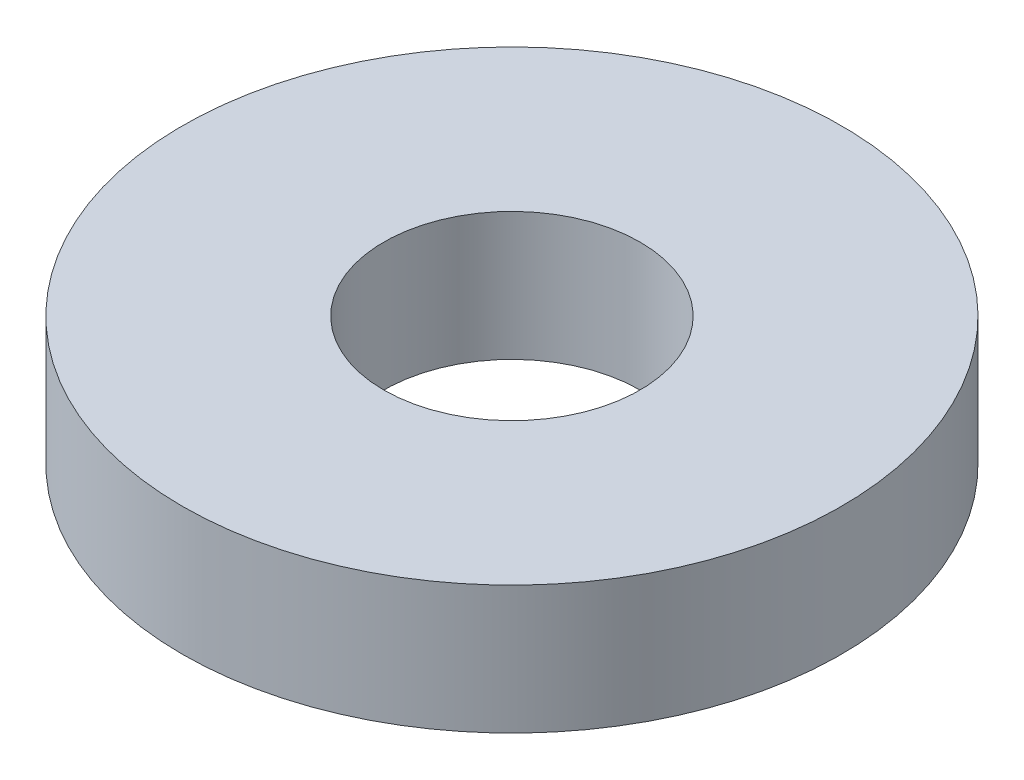
ISO-10303-21;
HEADER;
FILE_DESCRIPTION(('STEP AP214'),'2;1');
FILE_NAME('part.step','',(''),(''),'','','');
FILE_SCHEMA(('AUTOMOTIVE_DESIGN { 1 0 10303 214 1 1 1 1 }'));
ENDSEC;
DATA;
#1=APPLICATION_CONTEXT('core data for automotive mechanical design processes');
#2=APPLICATION_PROTOCOL_DEFINITION('international standard','automotive_design',2000,#1);
#3=PRODUCT_CONTEXT('',#1,'mechanical');
#4=PRODUCT('Part','Part','',(#3));
#5=PRODUCT_RELATED_PRODUCT_CATEGORY('part','',(#4));
#6=PRODUCT_DEFINITION_FORMATION('','',#4);
#7=PRODUCT_DEFINITION_CONTEXT('part definition',#1,'design');
#8=PRODUCT_DEFINITION('design','',#6,#7);
#9=PRODUCT_DEFINITION_SHAPE('','',#8);
#10=(LENGTH_UNIT() NAMED_UNIT(*) SI_UNIT(.MILLI.,.METRE.));
#11=(NAMED_UNIT(*) PLANE_ANGLE_UNIT() SI_UNIT($,.RADIAN.));
#12=(NAMED_UNIT(*) SI_UNIT($,.STERADIAN.) SOLID_ANGLE_UNIT());
#13=UNCERTAINTY_MEASURE_WITH_UNIT(LENGTH_MEASURE(1.E-05),#10,'distance_accuracy_value','');
#14=(GEOMETRIC_REPRESENTATION_CONTEXT(3) GLOBAL_UNCERTAINTY_ASSIGNED_CONTEXT((#13)) GLOBAL_UNIT_ASSIGNED_CONTEXT((#10,
#11,#12)) REPRESENTATION_CONTEXT('',''));
#15=CARTESIAN_POINT('',(0.,0.,0.));
#16=DIRECTION('',(0.,0.,1.));
#17=DIRECTION('',(1.,0.,0.));
#18=AXIS2_PLACEMENT_3D('',#15,#16,#17);
#19=CARTESIAN_POINT('',(0.,7.,0.));
#20=DIRECTION('',(0.,1.,0.));
#21=DIRECTION('',(0.,0.,1.));
#22=AXIS2_PLACEMENT_3D('',#19,#20,#21);
#23=PLANE('',#22);
#24=CARTESIAN_POINT('',(0.,7.,0.));
#25=DIRECTION('',(0.,1.,0.));
#26=DIRECTION('',(0.,0.,1.));
#27=AXIS2_PLACEMENT_3D('',#24,#25,#26);
#28=CIRCLE('',#27,18.);
#29=CARTESIAN_POINT('',(0.,7.,18.));
#30=VERTEX_POINT('',#29);
#31=EDGE_CURVE('E10',#30,#30,#28,.T.);
#32=ORIENTED_EDGE('',*,*,#31,.T.);
#33=EDGE_LOOP('',(#32));
#34=FACE_BOUND('',#33,.T.);
#35=CARTESIAN_POINT('',(0.,7.,0.));
#36=DIRECTION('',(0.,1.,0.));
#37=DIRECTION('',(0.,0.,1.));
#38=AXIS2_PLACEMENT_3D('',#35,#36,#37);
#39=CIRCLE('',#38,7.);
#40=CARTESIAN_POINT('',(0.,7.,7.));
#41=VERTEX_POINT('',#40);
#42=EDGE_CURVE('E40',#41,#41,#39,.T.);
#43=ORIENTED_EDGE('',*,*,#42,.F.);
#44=EDGE_LOOP('',(#43));
#45=FACE_BOUND('',#44,.T.);
#46=ADVANCED_FACE('F29',(#34,#45),#23,.T.);
#47=CARTESIAN_POINT('',(0.,0.,0.));
#48=DIRECTION('',(0.,1.,0.));
#49=DIRECTION('',(0.,0.,1.));
#50=AXIS2_PLACEMENT_3D('',#47,#48,#49);
#51=PLANE('',#50);
#52=CARTESIAN_POINT('',(0.,0.,0.));
#53=DIRECTION('',(0.,1.,0.));
#54=DIRECTION('',(0.,0.,1.));
#55=AXIS2_PLACEMENT_3D('',#52,#53,#54);
#56=CIRCLE('',#55,18.);
#57=CARTESIAN_POINT('',(0.,0.,18.));
#58=VERTEX_POINT('',#57);
#59=EDGE_CURVE('E33',#58,#58,#56,.T.);
#60=ORIENTED_EDGE('',*,*,#59,.F.);
#61=EDGE_LOOP('',(#60));
#62=FACE_BOUND('',#61,.T.);
#63=CARTESIAN_POINT('',(0.,0.,0.));
#64=DIRECTION('',(0.,1.,0.));
#65=DIRECTION('',(0.,0.,1.));
#66=AXIS2_PLACEMENT_3D('',#63,#64,#65);
#67=CIRCLE('',#66,7.);
#68=CARTESIAN_POINT('',(0.,0.,7.));
#69=VERTEX_POINT('',#68);
#70=EDGE_CURVE('E42',#69,#69,#67,.T.);
#71=ORIENTED_EDGE('',*,*,#70,.T.);
#72=EDGE_LOOP('',(#71));
#73=FACE_BOUND('',#72,.T.);
#74=ADVANCED_FACE('F52',(#62,#73),#51,.F.);
#75=CARTESIAN_POINT('',(0.,7.,0.));
#76=DIRECTION('',(0.,-1.,0.));
#77=DIRECTION('',(0.,0.,-1.));
#78=AXIS2_PLACEMENT_3D('',#75,#76,#77);
#79=CYLINDRICAL_SURFACE('',#78,18.);
#80=ORIENTED_EDGE('',*,*,#31,.F.);
#81=EDGE_LOOP('',(#80));
#82=FACE_BOUND('',#81,.T.);
#83=ORIENTED_EDGE('',*,*,#59,.T.);
#84=EDGE_LOOP('',(#83));
#85=FACE_BOUND('',#84,.T.);
#86=ADVANCED_FACE('F31',(#82,#85),#79,.T.);
#87=CARTESIAN_POINT('',(0.,7.,0.));
#88=DIRECTION('',(0.,-1.,0.));
#89=DIRECTION('',(0.,0.,-1.));
#90=AXIS2_PLACEMENT_3D('',#87,#88,#89);
#91=CYLINDRICAL_SURFACE('',#90,7.);
#92=ORIENTED_EDGE('',*,*,#42,.T.);
#93=EDGE_LOOP('',(#92));
#94=FACE_BOUND('',#93,.T.);
#95=ORIENTED_EDGE('',*,*,#70,.F.);
#96=EDGE_LOOP('',(#95));
#97=FACE_BOUND('',#96,.T.);
#98=ADVANCED_FACE('F48',(#94,#97),#91,.F.);
#99=CLOSED_SHELL('',(#46,#74,#86,#98));
#100=MANIFOLD_SOLID_BREP('B2',#99);
#101=ADVANCED_BREP_SHAPE_REPRESENTATION('',(#18,#100),#14);
#102=SHAPE_DEFINITION_REPRESENTATION(#9,#101);
ENDSEC;
END-ISO-10303-21;
